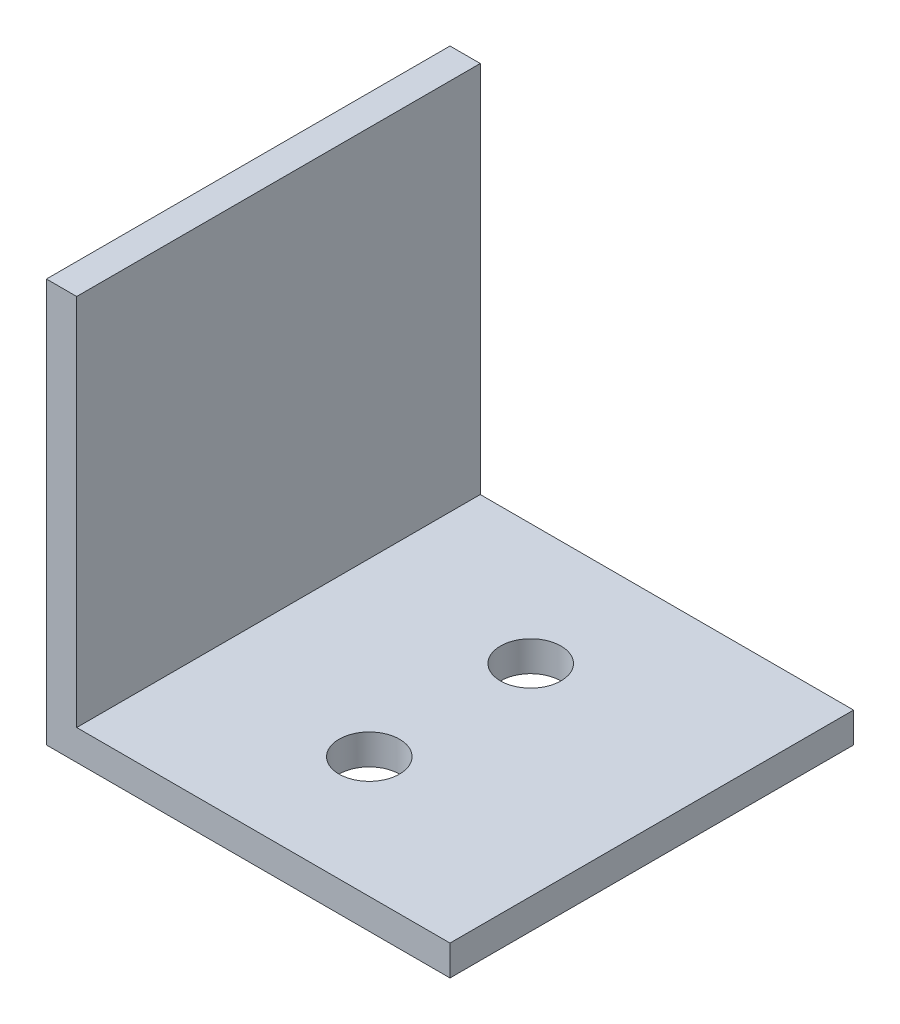
ISO-10303-21;
HEADER;
FILE_DESCRIPTION(('STEP AP214'),'2;1');
FILE_NAME('part.step','',(''),(''),'','','');
FILE_SCHEMA(('AUTOMOTIVE_DESIGN { 1 0 10303 214 1 1 1 1 }'));
ENDSEC;
DATA;
#1=APPLICATION_CONTEXT('core data for automotive mechanical design processes');
#2=APPLICATION_PROTOCOL_DEFINITION('international standard','automotive_design',2000,#1);
#3=PRODUCT_CONTEXT('',#1,'mechanical');
#4=PRODUCT('Part','Part','',(#3));
#5=PRODUCT_RELATED_PRODUCT_CATEGORY('part','',(#4));
#6=PRODUCT_DEFINITION_FORMATION('','',#4);
#7=PRODUCT_DEFINITION_CONTEXT('part definition',#1,'design');
#8=PRODUCT_DEFINITION('design','',#6,#7);
#9=PRODUCT_DEFINITION_SHAPE('','',#8);
#10=(LENGTH_UNIT() NAMED_UNIT(*) SI_UNIT(.MILLI.,.METRE.));
#11=(NAMED_UNIT(*) PLANE_ANGLE_UNIT() SI_UNIT($,.RADIAN.));
#12=(NAMED_UNIT(*) SI_UNIT($,.STERADIAN.) SOLID_ANGLE_UNIT());
#13=UNCERTAINTY_MEASURE_WITH_UNIT(LENGTH_MEASURE(1.E-05),#10,'distance_accuracy_value','');
#14=(GEOMETRIC_REPRESENTATION_CONTEXT(3) GLOBAL_UNCERTAINTY_ASSIGNED_CONTEXT((#13)) GLOBAL_UNIT_ASSIGNED_CONTEXT((#10,
#11,#12)) REPRESENTATION_CONTEXT('',''));
#15=CARTESIAN_POINT('',(0.,0.,0.));
#16=DIRECTION('',(0.,0.,1.));
#17=DIRECTION('',(1.,0.,0.));
#18=AXIS2_PLACEMENT_3D('',#15,#16,#17);
#19=CARTESIAN_POINT('',(-17.2142713590001,3.49808917197452,20.));
#20=DIRECTION('',(0.,-1.,0.));
#21=DIRECTION('',(1.,0.,0.));
#22=AXIS2_PLACEMENT_3D('',#19,#20,#21);
#23=PLANE('',#22);
#24=DIRECTION('',(-1.,0.,0.));
#25=VECTOR('',#24,1.);
#26=CARTESIAN_POINT('',(-17.2142713590001,3.49808917197452,0.));
#27=LINE('',#26,#25);
#28=CARTESIAN_POINT('',(-17.2142713590001,3.49808917197452,0.));
#29=VERTEX_POINT('',#28);
#30=CARTESIAN_POINT('',(-18.7142713590001,3.49808917197452,0.));
#31=VERTEX_POINT('',#30);
#32=EDGE_CURVE('E115',#29,#31,#27,.T.);
#33=ORIENTED_EDGE('',*,*,#32,.T.);
#34=DIRECTION('',(0.,0.,-1.));
#35=VECTOR('',#34,1.);
#36=CARTESIAN_POINT('',(-18.7142713590001,3.49808917197452,20.));
#37=LINE('',#36,#35);
#38=CARTESIAN_POINT('',(-18.7142713590001,3.49808917197452,20.));
#39=VERTEX_POINT('',#38);
#40=EDGE_CURVE('E11',#39,#31,#37,.T.);
#41=ORIENTED_EDGE('',*,*,#40,.F.);
#42=DIRECTION('',(-1.,0.,0.));
#43=VECTOR('',#42,1.);
#44=CARTESIAN_POINT('',(-17.2142713590001,3.49808917197452,20.));
#45=LINE('',#44,#43);
#46=CARTESIAN_POINT('',(-17.2142713590001,3.49808917197452,20.));
#47=VERTEX_POINT('',#46);
#48=EDGE_CURVE('E126',#47,#39,#45,.T.);
#49=ORIENTED_EDGE('',*,*,#48,.F.);
#50=DIRECTION('',(0.,0.,-1.));
#51=VECTOR('',#50,1.);
#52=CARTESIAN_POINT('',(-17.2142713590001,3.49808917197452,20.));
#53=LINE('',#52,#51);
#54=EDGE_CURVE('E111',#47,#29,#53,.T.);
#55=ORIENTED_EDGE('',*,*,#54,.T.);
#56=EDGE_LOOP('',(#33,#41,#49,#55));
#57=FACE_BOUND('',#56,.T.);
#58=ADVANCED_FACE('F31',(#57),#23,.F.);
#59=CARTESIAN_POINT('',(-18.7142713590001,3.49808917197452,20.));
#60=DIRECTION('',(1.,0.,0.));
#61=DIRECTION('',(0.,1.,0.));
#62=AXIS2_PLACEMENT_3D('',#59,#60,#61);
#63=PLANE('',#62);
#64=DIRECTION('',(0.,-1.,0.));
#65=VECTOR('',#64,1.);
#66=CARTESIAN_POINT('',(-18.7142713590001,3.49808917197452,0.));
#67=LINE('',#66,#65);
#68=CARTESIAN_POINT('',(-18.7142713590001,-16.5019108280255,0.));
#69=VERTEX_POINT('',#68);
#70=EDGE_CURVE('E118',#31,#69,#67,.T.);
#71=ORIENTED_EDGE('',*,*,#70,.T.);
#72=DIRECTION('',(0.,0.,-1.));
#73=VECTOR('',#72,1.);
#74=CARTESIAN_POINT('',(-18.7142713590001,-16.5019108280255,20.));
#75=LINE('',#74,#73);
#76=CARTESIAN_POINT('',(-18.7142713590001,-16.5019108280255,20.));
#77=VERTEX_POINT('',#76);
#78=EDGE_CURVE('E39',#77,#69,#75,.T.);
#79=ORIENTED_EDGE('',*,*,#78,.F.);
#80=DIRECTION('',(0.,-1.,0.));
#81=VECTOR('',#80,1.);
#82=CARTESIAN_POINT('',(-18.7142713590001,3.49808917197452,20.));
#83=LINE('',#82,#81);
#84=EDGE_CURVE('E84',#39,#77,#83,.T.);
#85=ORIENTED_EDGE('',*,*,#84,.F.);
#86=ORIENTED_EDGE('',*,*,#40,.T.);
#87=EDGE_LOOP('',(#71,#79,#85,#86));
#88=FACE_BOUND('',#87,.T.);
#89=ADVANCED_FACE('F151',(#88),#63,.F.);
#90=CARTESIAN_POINT('',(-18.7142713590001,-16.5019108280255,20.));
#91=DIRECTION('',(0.,1.,0.));
#92=DIRECTION('',(0.,0.,1.));
#93=AXIS2_PLACEMENT_3D('',#90,#91,#92);
#94=PLANE('',#93);
#95=CARTESIAN_POINT('',(-8.71427135900006,-16.5019108280255,6.));
#96=DIRECTION('',(0.,1.,0.));
#97=DIRECTION('',(0.,0.,1.));
#98=AXIS2_PLACEMENT_3D('',#95,#96,#97);
#99=CIRCLE('',#98,1.5);
#100=CARTESIAN_POINT('',(-8.71427135900006,-16.5019108280255,7.5));
#101=VERTEX_POINT('',#100);
#102=EDGE_CURVE('E219',#101,#101,#99,.T.);
#103=ORIENTED_EDGE('',*,*,#102,.T.);
#104=EDGE_LOOP('',(#103));
#105=FACE_BOUND('',#104,.T.);
#106=CARTESIAN_POINT('',(-8.71427135900006,-16.5019108280255,14.));
#107=DIRECTION('',(0.,1.,0.));
#108=DIRECTION('',(0.,0.,1.));
#109=AXIS2_PLACEMENT_3D('',#106,#107,#108);
#110=CIRCLE('',#109,1.5);
#111=CARTESIAN_POINT('',(-8.71427135900006,-16.5019108280255,15.5));
#112=VERTEX_POINT('',#111);
#113=EDGE_CURVE('E119',#112,#112,#110,.T.);
#114=ORIENTED_EDGE('',*,*,#113,.T.);
#115=EDGE_LOOP('',(#114));
#116=FACE_BOUND('',#115,.T.);
#117=DIRECTION('',(1.,0.,0.));
#118=VECTOR('',#117,1.);
#119=CARTESIAN_POINT('',(-18.7142713590001,-16.5019108280255,0.));
#120=LINE('',#119,#118);
#121=CARTESIAN_POINT('',(1.28572864099994,-16.5019108280255,0.));
#122=VERTEX_POINT('',#121);
#123=EDGE_CURVE('E121',#69,#122,#120,.T.);
#124=ORIENTED_EDGE('',*,*,#123,.T.);
#125=DIRECTION('',(0.,0.,-1.));
#126=VECTOR('',#125,1.);
#127=CARTESIAN_POINT('',(1.28572864099994,-16.5019108280255,20.));
#128=LINE('',#127,#126);
#129=CARTESIAN_POINT('',(1.28572864099994,-16.5019108280255,20.));
#130=VERTEX_POINT('',#129);
#131=EDGE_CURVE('E106',#130,#122,#128,.T.);
#132=ORIENTED_EDGE('',*,*,#131,.F.);
#133=DIRECTION('',(1.,0.,0.));
#134=VECTOR('',#133,1.);
#135=CARTESIAN_POINT('',(-18.7142713590001,-16.5019108280255,20.));
#136=LINE('',#135,#134);
#137=EDGE_CURVE('E97',#77,#130,#136,.T.);
#138=ORIENTED_EDGE('',*,*,#137,.F.);
#139=ORIENTED_EDGE('',*,*,#78,.T.);
#140=EDGE_LOOP('',(#124,#132,#138,#139));
#141=FACE_BOUND('',#140,.T.);
#142=ADVANCED_FACE('F132',(#105,#116,#141),#94,.F.);
#143=CARTESIAN_POINT('',(1.28572864099994,-16.5019108280255,20.));
#144=DIRECTION('',(-1.,0.,0.));
#145=DIRECTION('',(0.,0.,1.));
#146=AXIS2_PLACEMENT_3D('',#143,#144,#145);
#147=PLANE('',#146);
#148=DIRECTION('',(0.,1.,0.));
#149=VECTOR('',#148,1.);
#150=CARTESIAN_POINT('',(1.28572864099994,-16.5019108280255,0.));
#151=LINE('',#150,#149);
#152=CARTESIAN_POINT('',(1.28572864099994,-15.0019108280255,0.));
#153=VERTEX_POINT('',#152);
#154=EDGE_CURVE('E105',#122,#153,#151,.T.);
#155=ORIENTED_EDGE('',*,*,#154,.T.);
#156=DIRECTION('',(0.,0.,-1.));
#157=VECTOR('',#156,1.);
#158=CARTESIAN_POINT('',(1.28572864099994,-15.0019108280255,20.));
#159=LINE('',#158,#157);
#160=CARTESIAN_POINT('',(1.28572864099994,-15.0019108280255,20.));
#161=VERTEX_POINT('',#160);
#162=EDGE_CURVE('E102',#161,#153,#159,.T.);
#163=ORIENTED_EDGE('',*,*,#162,.F.);
#164=DIRECTION('',(0.,1.,0.));
#165=VECTOR('',#164,1.);
#166=CARTESIAN_POINT('',(1.28572864099994,-16.5019108280255,20.));
#167=LINE('',#166,#165);
#168=EDGE_CURVE('E91',#130,#161,#167,.T.);
#169=ORIENTED_EDGE('',*,*,#168,.F.);
#170=ORIENTED_EDGE('',*,*,#131,.T.);
#171=EDGE_LOOP('',(#155,#163,#169,#170));
#172=FACE_BOUND('',#171,.T.);
#173=ADVANCED_FACE('F103',(#172),#147,.F.);
#174=CARTESIAN_POINT('',(1.28572864099994,-15.0019108280255,20.));
#175=DIRECTION('',(0.,-1.,0.));
#176=DIRECTION('',(1.,0.,0.));
#177=AXIS2_PLACEMENT_3D('',#174,#175,#176);
#178=PLANE('',#177);
#179=CARTESIAN_POINT('',(-8.71427135900006,-15.0019108280255,6.));
#180=DIRECTION('',(0.,1.,0.));
#181=DIRECTION('',(-1.,0.,0.));
#182=AXIS2_PLACEMENT_3D('',#179,#180,#181);
#183=CIRCLE('',#182,1.5);
#184=CARTESIAN_POINT('',(-10.2142713590001,-15.0019108280255,6.));
#185=VERTEX_POINT('',#184);
#186=EDGE_CURVE('E216',#185,#185,#183,.T.);
#187=ORIENTED_EDGE('',*,*,#186,.F.);
#188=EDGE_LOOP('',(#187));
#189=FACE_BOUND('',#188,.T.);
#190=CARTESIAN_POINT('',(-8.71427135900006,-15.0019108280255,14.));
#191=DIRECTION('',(0.,1.,0.));
#192=DIRECTION('',(-1.,0.,0.));
#193=AXIS2_PLACEMENT_3D('',#190,#191,#192);
#194=CIRCLE('',#193,1.5);
#195=CARTESIAN_POINT('',(-10.2142713590001,-15.0019108280255,14.));
#196=VERTEX_POINT('',#195);
#197=EDGE_CURVE('E220',#196,#196,#194,.T.);
#198=ORIENTED_EDGE('',*,*,#197,.F.);
#199=EDGE_LOOP('',(#198));
#200=FACE_BOUND('',#199,.T.);
#201=DIRECTION('',(-1.,0.,0.));
#202=VECTOR('',#201,1.);
#203=CARTESIAN_POINT('',(1.28572864099994,-15.0019108280255,0.));
#204=LINE('',#203,#202);
#205=CARTESIAN_POINT('',(-17.2142713590001,-15.0019108280255,0.));
#206=VERTEX_POINT('',#205);
#207=EDGE_CURVE('E70',#153,#206,#204,.T.);
#208=ORIENTED_EDGE('',*,*,#207,.T.);
#209=DIRECTION('',(0.,0.,-1.));
#210=VECTOR('',#209,1.);
#211=CARTESIAN_POINT('',(-17.2142713590001,-15.0019108280255,20.));
#212=LINE('',#211,#210);
#213=CARTESIAN_POINT('',(-17.2142713590001,-15.0019108280255,20.));
#214=VERTEX_POINT('',#213);
#215=EDGE_CURVE('E107',#214,#206,#212,.T.);
#216=ORIENTED_EDGE('',*,*,#215,.F.);
#217=DIRECTION('',(-1.,0.,0.));
#218=VECTOR('',#217,1.);
#219=CARTESIAN_POINT('',(1.28572864099994,-15.0019108280255,20.));
#220=LINE('',#219,#218);
#221=EDGE_CURVE('E95',#161,#214,#220,.T.);
#222=ORIENTED_EDGE('',*,*,#221,.F.);
#223=ORIENTED_EDGE('',*,*,#162,.T.);
#224=EDGE_LOOP('',(#208,#216,#222,#223));
#225=FACE_BOUND('',#224,.T.);
#226=ADVANCED_FACE('F109',(#189,#200,#225),#178,.F.);
#227=CARTESIAN_POINT('',(-17.2142713590001,-15.0019108280255,20.));
#228=DIRECTION('',(-1.,0.,0.));
#229=DIRECTION('',(0.,0.,1.));
#230=AXIS2_PLACEMENT_3D('',#227,#228,#229);
#231=PLANE('',#230);
#232=DIRECTION('',(0.,1.,0.));
#233=VECTOR('',#232,1.);
#234=CARTESIAN_POINT('',(-17.2142713590001,-15.0019108280255,0.));
#235=LINE('',#234,#233);
#236=EDGE_CURVE('E76',#206,#29,#235,.T.);
#237=ORIENTED_EDGE('',*,*,#236,.T.);
#238=ORIENTED_EDGE('',*,*,#54,.F.);
#239=DIRECTION('',(0.,1.,0.));
#240=VECTOR('',#239,1.);
#241=CARTESIAN_POINT('',(-17.2142713590001,-15.0019108280255,20.));
#242=LINE('',#241,#240);
#243=EDGE_CURVE('E47',#214,#47,#242,.T.);
#244=ORIENTED_EDGE('',*,*,#243,.F.);
#245=ORIENTED_EDGE('',*,*,#215,.T.);
#246=EDGE_LOOP('',(#237,#238,#244,#245));
#247=FACE_BOUND('',#246,.T.);
#248=ADVANCED_FACE('F139',(#247),#231,.F.);
#249=CARTESIAN_POINT('',(-18.7142713590001,3.49808917197452,20.));
#250=DIRECTION('',(0.,0.,1.));
#251=DIRECTION('',(1.,0.,0.));
#252=AXIS2_PLACEMENT_3D('',#249,#250,#251);
#253=PLANE('',#252);
#254=ORIENTED_EDGE('',*,*,#48,.T.);
#255=ORIENTED_EDGE('',*,*,#84,.T.);
#256=ORIENTED_EDGE('',*,*,#137,.T.);
#257=ORIENTED_EDGE('',*,*,#168,.T.);
#258=ORIENTED_EDGE('',*,*,#221,.T.);
#259=ORIENTED_EDGE('',*,*,#243,.T.);
#260=EDGE_LOOP('',(#254,#255,#256,#257,#258,#259));
#261=FACE_BOUND('',#260,.T.);
#262=ADVANCED_FACE('F93',(#261),#253,.T.);
#263=CARTESIAN_POINT('',(-18.7142713590001,3.49808917197452,0.));
#264=DIRECTION('',(0.,0.,1.));
#265=DIRECTION('',(1.,0.,0.));
#266=AXIS2_PLACEMENT_3D('',#263,#264,#265);
#267=PLANE('',#266);
#268=ORIENTED_EDGE('',*,*,#32,.F.);
#269=ORIENTED_EDGE('',*,*,#236,.F.);
#270=ORIENTED_EDGE('',*,*,#207,.F.);
#271=ORIENTED_EDGE('',*,*,#154,.F.);
#272=ORIENTED_EDGE('',*,*,#123,.F.);
#273=ORIENTED_EDGE('',*,*,#70,.F.);
#274=EDGE_LOOP('',(#268,#269,#270,#271,#272,#273));
#275=FACE_BOUND('',#274,.T.);
#276=ADVANCED_FACE('F135',(#275),#267,.F.);
#277=CARTESIAN_POINT('',(-8.71427135900005,-35.0019108280255,14.));
#278=DIRECTION('',(0.,1.,0.));
#279=DIRECTION('',(-1.,0.,0.));
#280=AXIS2_PLACEMENT_3D('',#277,#278,#279);
#281=CYLINDRICAL_SURFACE('',#280,1.5);
#282=ORIENTED_EDGE('',*,*,#197,.T.);
#283=EDGE_LOOP('',(#282));
#284=FACE_BOUND('',#283,.T.);
#285=ORIENTED_EDGE('',*,*,#113,.F.);
#286=EDGE_LOOP('',(#285));
#287=FACE_BOUND('',#286,.T.);
#288=ADVANCED_FACE('F179',(#284,#287),#281,.F.);
#289=CARTESIAN_POINT('',(-8.71427135900005,-35.0019108280255,6.));
#290=DIRECTION('',(0.,1.,0.));
#291=DIRECTION('',(-1.,0.,0.));
#292=AXIS2_PLACEMENT_3D('',#289,#290,#291);
#293=CYLINDRICAL_SURFACE('',#292,1.5);
#294=ORIENTED_EDGE('',*,*,#186,.T.);
#295=EDGE_LOOP('',(#294));
#296=FACE_BOUND('',#295,.T.);
#297=ORIENTED_EDGE('',*,*,#102,.F.);
#298=EDGE_LOOP('',(#297));
#299=FACE_BOUND('',#298,.T.);
#300=ADVANCED_FACE('F184',(#296,#299),#293,.F.);
#301=CLOSED_SHELL('',(#58,#89,#142,#173,#226,#248,#262,#276,#288,#300));
#302=MANIFOLD_SOLID_BREP('B2',#301);
#303=ADVANCED_BREP_SHAPE_REPRESENTATION('',(#18,#302),#14);
#304=SHAPE_DEFINITION_REPRESENTATION(#9,#303);
ENDSEC;
END-ISO-10303-21;
